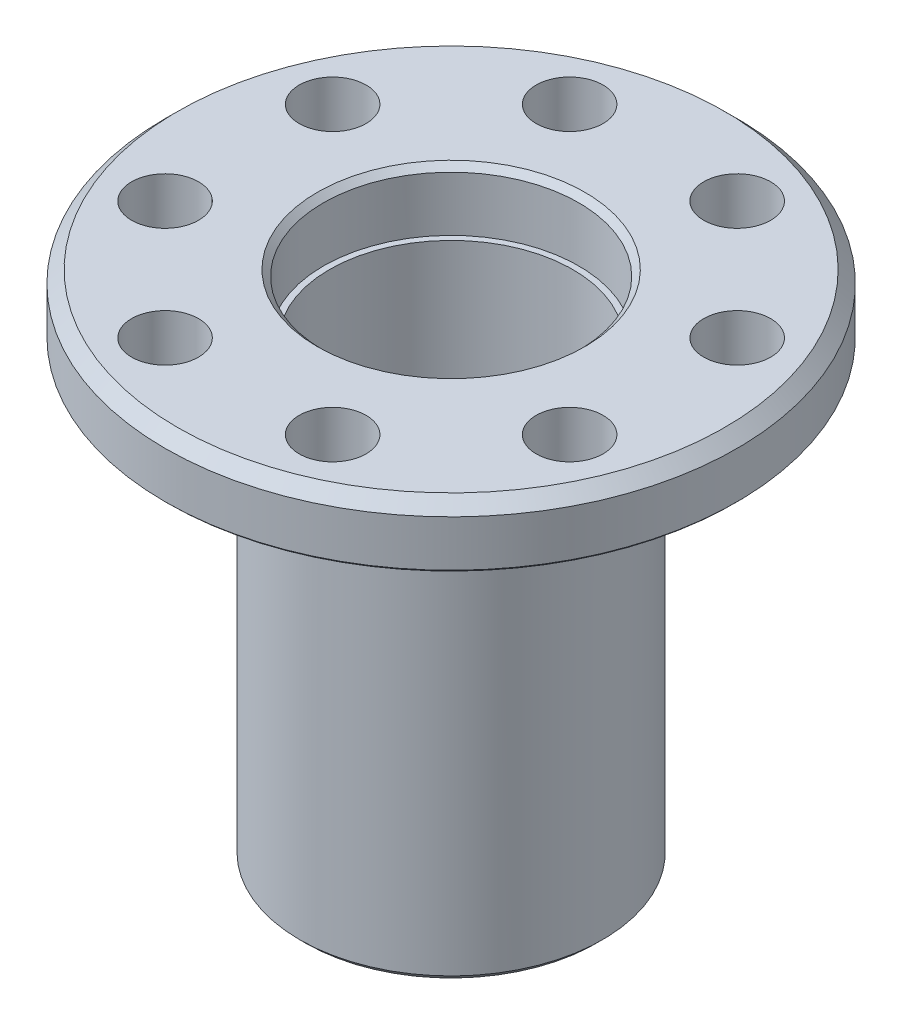
ISO-10303-21;
HEADER;
FILE_DESCRIPTION(('STEP AP214'),'2;1');
FILE_NAME('part.step','',(''),(''),'','','');
FILE_SCHEMA(('AUTOMOTIVE_DESIGN { 1 0 10303 214 1 1 1 1 }'));
ENDSEC;
DATA;
#1=APPLICATION_CONTEXT('core data for automotive mechanical design processes');
#2=APPLICATION_PROTOCOL_DEFINITION('international standard','automotive_design',2000,#1);
#3=PRODUCT_CONTEXT('',#1,'mechanical');
#4=PRODUCT('Part','Part','',(#3));
#5=PRODUCT_RELATED_PRODUCT_CATEGORY('part','',(#4));
#6=PRODUCT_DEFINITION_FORMATION('','',#4);
#7=PRODUCT_DEFINITION_CONTEXT('part definition',#1,'design');
#8=PRODUCT_DEFINITION('design','',#6,#7);
#9=PRODUCT_DEFINITION_SHAPE('','',#8);
#10=(LENGTH_UNIT() NAMED_UNIT(*) SI_UNIT(.MILLI.,.METRE.));
#11=(NAMED_UNIT(*) PLANE_ANGLE_UNIT() SI_UNIT($,.RADIAN.));
#12=(NAMED_UNIT(*) SI_UNIT($,.STERADIAN.) SOLID_ANGLE_UNIT());
#13=UNCERTAINTY_MEASURE_WITH_UNIT(LENGTH_MEASURE(1.E-05),#10,'distance_accuracy_value','');
#14=(GEOMETRIC_REPRESENTATION_CONTEXT(3) GLOBAL_UNCERTAINTY_ASSIGNED_CONTEXT((#13)) GLOBAL_UNIT_ASSIGNED_CONTEXT((#10,
#11,#12)) REPRESENTATION_CONTEXT('',''));
#15=CARTESIAN_POINT('',(0.,0.,0.));
#16=DIRECTION('',(0.,0.,1.));
#17=DIRECTION('',(1.,0.,0.));
#18=AXIS2_PLACEMENT_3D('',#15,#16,#17);
#19=CARTESIAN_POINT('',(16.6298315852,42.,6.888301782572));
#20=DIRECTION('',(0.,-1.,0.));
#21=DIRECTION('',(0.707106781186548,0.,0.707106781186548));
#22=AXIS2_PLACEMENT_3D('',#19,#20,#21);
#23=CYLINDRICAL_SURFACE('',#22,2.75);
#24=CARTESIAN_POINT('',(16.6298315852,42.,6.888301782572));
#25=DIRECTION('',(0.,-1.,0.));
#26=DIRECTION('',(0.707106781186597,0.,0.707106781186498));
#27=AXIS2_PLACEMENT_3D('',#24,#25,#26);
#28=CIRCLE('',#27,2.75);
#29=CARTESIAN_POINT('',(14.685287936937,42.,4.94375813430899));
#30=VERTEX_POINT('',#29);
#31=EDGE_CURVE('E204',#30,#30,#28,.T.);
#32=ORIENTED_EDGE('',*,*,#31,.F.);
#33=DIRECTION('',(0.,-1.,0.));
#34=VECTOR('',#33,1.);
#35=CARTESIAN_POINT('',(14.685287936937,42.,4.94375813430899));
#36=LINE('',#35,#34);
#37=CARTESIAN_POINT('',(14.685287936937,37.,4.94375813430899));
#38=VERTEX_POINT('',#37);
#39=EDGE_CURVE('E11',#30,#38,#36,.T.);
#40=ORIENTED_EDGE('',*,*,#39,.T.);
#41=CARTESIAN_POINT('',(16.6298315852,37.,6.888301782572));
#42=DIRECTION('',(0.,-1.,0.));
#43=DIRECTION('',(0.707106781186597,0.,0.707106781186498));
#44=AXIS2_PLACEMENT_3D('',#41,#42,#43);
#45=CIRCLE('',#44,2.75);
#46=EDGE_CURVE('E206',#38,#38,#45,.T.);
#47=ORIENTED_EDGE('',*,*,#46,.T.);
#48=ORIENTED_EDGE('',*,*,#39,.F.);
#49=EDGE_LOOP('',(#32,#40,#47,#48));
#50=FACE_BOUND('',#49,.T.);
#51=ADVANCED_FACE('F17',(#50),#23,.F.);
#52=CARTESIAN_POINT('',(6.888301782572,42.,16.6298315852));
#53=DIRECTION('',(0.,-1.,0.));
#54=DIRECTION('',(0.,0.,1.));
#55=AXIS2_PLACEMENT_3D('',#52,#53,#54);
#56=CYLINDRICAL_SURFACE('',#55,2.75);
#57=CARTESIAN_POINT('',(6.888301782572,42.,16.6298315852));
#58=DIRECTION('',(0.,-1.,0.));
#59=DIRECTION('',(0.,0.,1.));
#60=AXIS2_PLACEMENT_3D('',#57,#58,#59);
#61=CIRCLE('',#60,2.75);
#62=CARTESIAN_POINT('',(6.888301782572,42.,13.8798315852));
#63=VERTEX_POINT('',#62);
#64=EDGE_CURVE('E212',#63,#63,#61,.T.);
#65=ORIENTED_EDGE('',*,*,#64,.F.);
#66=DIRECTION('',(0.,-1.,0.));
#67=VECTOR('',#66,1.);
#68=CARTESIAN_POINT('',(6.888301782572,42.,13.8798315852));
#69=LINE('',#68,#67);
#70=CARTESIAN_POINT('',(6.888301782572,37.,13.8798315852));
#71=VERTEX_POINT('',#70);
#72=EDGE_CURVE('E28',#63,#71,#69,.T.);
#73=ORIENTED_EDGE('',*,*,#72,.T.);
#74=CARTESIAN_POINT('',(6.888301782572,37.,16.6298315852));
#75=DIRECTION('',(0.,-1.,0.));
#76=DIRECTION('',(0.,0.,1.));
#77=AXIS2_PLACEMENT_3D('',#74,#75,#76);
#78=CIRCLE('',#77,2.75);
#79=EDGE_CURVE('E243',#71,#71,#78,.T.);
#80=ORIENTED_EDGE('',*,*,#79,.T.);
#81=ORIENTED_EDGE('',*,*,#72,.F.);
#82=EDGE_LOOP('',(#65,#73,#80,#81));
#83=FACE_BOUND('',#82,.T.);
#84=ADVANCED_FACE('F702',(#83),#56,.F.);
#85=CARTESIAN_POINT('',(-6.888301782572,42.,16.6298315852));
#86=DIRECTION('',(0.,-1.,0.));
#87=DIRECTION('',(-0.707106781186548,0.,0.707106781186548));
#88=AXIS2_PLACEMENT_3D('',#85,#86,#87);
#89=CYLINDRICAL_SURFACE('',#88,2.75);
#90=CARTESIAN_POINT('',(-6.888301782572,42.,16.6298315852));
#91=DIRECTION('',(0.,-1.,0.));
#92=DIRECTION('',(-0.707106781186548,0.,0.707106781186548));
#93=AXIS2_PLACEMENT_3D('',#90,#91,#92);
#94=CIRCLE('',#93,2.75);
#95=CARTESIAN_POINT('',(-4.94375813430899,42.,14.685287936937));
#96=VERTEX_POINT('',#95);
#97=EDGE_CURVE('E223',#96,#96,#94,.T.);
#98=ORIENTED_EDGE('',*,*,#97,.F.);
#99=DIRECTION('',(0.,-1.,0.));
#100=VECTOR('',#99,1.);
#101=CARTESIAN_POINT('',(-4.94375813430899,42.,14.685287936937));
#102=LINE('',#101,#100);
#103=CARTESIAN_POINT('',(-4.94375813430899,37.,14.685287936937));
#104=VERTEX_POINT('',#103);
#105=EDGE_CURVE('E235',#96,#104,#102,.T.);
#106=ORIENTED_EDGE('',*,*,#105,.T.);
#107=CARTESIAN_POINT('',(-6.888301782572,37.,16.6298315852));
#108=DIRECTION('',(0.,-1.,0.));
#109=DIRECTION('',(-0.707106781186548,0.,0.707106781186548));
#110=AXIS2_PLACEMENT_3D('',#107,#108,#109);
#111=CIRCLE('',#110,2.75);
#112=EDGE_CURVE('E239',#104,#104,#111,.T.);
#113=ORIENTED_EDGE('',*,*,#112,.T.);
#114=ORIENTED_EDGE('',*,*,#105,.F.);
#115=EDGE_LOOP('',(#98,#106,#113,#114));
#116=FACE_BOUND('',#115,.T.);
#117=ADVANCED_FACE('F739',(#116),#89,.F.);
#118=CARTESIAN_POINT('',(-16.6298315852,42.,6.888301782572));
#119=DIRECTION('',(0.,-1.,0.));
#120=DIRECTION('',(-1.,0.,0.));
#121=AXIS2_PLACEMENT_3D('',#118,#119,#120);
#122=CYLINDRICAL_SURFACE('',#121,2.75);
#123=CARTESIAN_POINT('',(-16.6298315852,42.,6.888301782572));
#124=DIRECTION('',(0.,-1.,0.));
#125=DIRECTION('',(-1.,0.,0.));
#126=AXIS2_PLACEMENT_3D('',#123,#124,#125);
#127=CIRCLE('',#126,2.75);
#128=CARTESIAN_POINT('',(-13.8798315852,42.,6.888301782572));
#129=VERTEX_POINT('',#128);
#130=EDGE_CURVE('E288',#129,#129,#127,.T.);
#131=ORIENTED_EDGE('',*,*,#130,.F.);
#132=DIRECTION('',(0.,-1.,0.));
#133=VECTOR('',#132,1.);
#134=CARTESIAN_POINT('',(-13.8798315852,42.,6.888301782572));
#135=LINE('',#134,#133);
#136=CARTESIAN_POINT('',(-13.8798315852,37.,6.888301782572));
#137=VERTEX_POINT('',#136);
#138=EDGE_CURVE('E238',#129,#137,#135,.T.);
#139=ORIENTED_EDGE('',*,*,#138,.T.);
#140=CARTESIAN_POINT('',(-16.6298315852,37.,6.888301782572));
#141=DIRECTION('',(0.,-1.,0.));
#142=DIRECTION('',(-1.,0.,0.));
#143=AXIS2_PLACEMENT_3D('',#140,#141,#142);
#144=CIRCLE('',#143,2.75);
#145=EDGE_CURVE('E244',#137,#137,#144,.T.);
#146=ORIENTED_EDGE('',*,*,#145,.T.);
#147=ORIENTED_EDGE('',*,*,#138,.F.);
#148=EDGE_LOOP('',(#131,#139,#146,#147));
#149=FACE_BOUND('',#148,.T.);
#150=ADVANCED_FACE('F774',(#149),#122,.F.);
#151=CARTESIAN_POINT('',(-16.6298315852,42.,-6.888301782572));
#152=DIRECTION('',(0.,-1.,0.));
#153=DIRECTION('',(-0.707106781186548,0.,-0.707106781186548));
#154=AXIS2_PLACEMENT_3D('',#151,#152,#153);
#155=CYLINDRICAL_SURFACE('',#154,2.75);
#156=CARTESIAN_POINT('',(-16.6298315852,42.,-6.888301782572));
#157=DIRECTION('',(0.,-1.,0.));
#158=DIRECTION('',(-0.707106781186548,0.,-0.707106781186548));
#159=AXIS2_PLACEMENT_3D('',#156,#157,#158);
#160=CIRCLE('',#159,2.75);
#161=CARTESIAN_POINT('',(-14.685287936937,42.,-4.94375813430899));
#162=VERTEX_POINT('',#161);
#163=EDGE_CURVE('E291',#162,#162,#160,.T.);
#164=ORIENTED_EDGE('',*,*,#163,.F.);
#165=DIRECTION('',(0.,-1.,0.));
#166=VECTOR('',#165,1.);
#167=CARTESIAN_POINT('',(-14.685287936937,42.,-4.94375813430899));
#168=LINE('',#167,#166);
#169=CARTESIAN_POINT('',(-14.685287936937,37.,-4.94375813430899));
#170=VERTEX_POINT('',#169);
#171=EDGE_CURVE('E686',#162,#170,#168,.T.);
#172=ORIENTED_EDGE('',*,*,#171,.T.);
#173=CARTESIAN_POINT('',(-16.6298315852,37.,-6.888301782572));
#174=DIRECTION('',(0.,-1.,0.));
#175=DIRECTION('',(-0.707106781186548,0.,-0.707106781186548));
#176=AXIS2_PLACEMENT_3D('',#173,#174,#175);
#177=CIRCLE('',#176,2.75);
#178=EDGE_CURVE('E353',#170,#170,#177,.T.);
#179=ORIENTED_EDGE('',*,*,#178,.T.);
#180=ORIENTED_EDGE('',*,*,#171,.F.);
#181=EDGE_LOOP('',(#164,#172,#179,#180));
#182=FACE_BOUND('',#181,.T.);
#183=ADVANCED_FACE('F19',(#182),#155,.F.);
#184=CARTESIAN_POINT('',(-6.888301782572,42.,-16.6298315852));
#185=DIRECTION('',(0.,-1.,0.));
#186=DIRECTION('',(0.,0.,-1.));
#187=AXIS2_PLACEMENT_3D('',#184,#185,#186);
#188=CYLINDRICAL_SURFACE('',#187,2.75);
#189=CARTESIAN_POINT('',(-6.888301782572,42.,-16.6298315852));
#190=DIRECTION('',(0.,-1.,0.));
#191=DIRECTION('',(0.,0.,-1.));
#192=AXIS2_PLACEMENT_3D('',#189,#190,#191);
#193=CIRCLE('',#192,2.75);
#194=CARTESIAN_POINT('',(-6.888301782572,42.,-13.8798315852));
#195=VERTEX_POINT('',#194);
#196=EDGE_CURVE('E276',#195,#195,#193,.T.);
#197=ORIENTED_EDGE('',*,*,#196,.F.);
#198=DIRECTION('',(0.,-1.,0.));
#199=VECTOR('',#198,1.);
#200=CARTESIAN_POINT('',(-6.888301782572,42.,-13.8798315852));
#201=LINE('',#200,#199);
#202=CARTESIAN_POINT('',(-6.888301782572,37.,-13.8798315852));
#203=VERTEX_POINT('',#202);
#204=EDGE_CURVE('E625',#195,#203,#201,.T.);
#205=ORIENTED_EDGE('',*,*,#204,.T.);
#206=CARTESIAN_POINT('',(-6.888301782572,37.,-16.6298315852));
#207=DIRECTION('',(0.,-1.,0.));
#208=DIRECTION('',(0.,0.,-1.));
#209=AXIS2_PLACEMENT_3D('',#206,#207,#208);
#210=CIRCLE('',#209,2.75);
#211=EDGE_CURVE('E368',#203,#203,#210,.T.);
#212=ORIENTED_EDGE('',*,*,#211,.T.);
#213=ORIENTED_EDGE('',*,*,#204,.F.);
#214=EDGE_LOOP('',(#197,#205,#212,#213));
#215=FACE_BOUND('',#214,.T.);
#216=ADVANCED_FACE('F804',(#215),#188,.F.);
#217=CARTESIAN_POINT('',(6.888301782572,42.,-16.6298315852));
#218=DIRECTION('',(0.,-1.,0.));
#219=DIRECTION('',(0.707106781186548,0.,-0.707106781186548));
#220=AXIS2_PLACEMENT_3D('',#217,#218,#219);
#221=CYLINDRICAL_SURFACE('',#220,2.75);
#222=CARTESIAN_POINT('',(6.888301782572,42.,-16.6298315852));
#223=DIRECTION('',(0.,-1.,0.));
#224=DIRECTION('',(0.707106781186548,0.,-0.707106781186548));
#225=AXIS2_PLACEMENT_3D('',#222,#223,#224);
#226=CIRCLE('',#225,2.75);
#227=CARTESIAN_POINT('',(4.94375813430899,42.,-14.685287936937));
#228=VERTEX_POINT('',#227);
#229=EDGE_CURVE('E272',#228,#228,#226,.T.);
#230=ORIENTED_EDGE('',*,*,#229,.F.);
#231=DIRECTION('',(0.,-1.,0.));
#232=VECTOR('',#231,1.);
#233=CARTESIAN_POINT('',(4.94375813430899,42.,-14.685287936937));
#234=LINE('',#233,#232);
#235=CARTESIAN_POINT('',(4.94375813430899,37.,-14.685287936937));
#236=VERTEX_POINT('',#235);
#237=EDGE_CURVE('E255',#228,#236,#234,.T.);
#238=ORIENTED_EDGE('',*,*,#237,.T.);
#239=CARTESIAN_POINT('',(6.888301782572,37.,-16.6298315852));
#240=DIRECTION('',(0.,-1.,0.));
#241=DIRECTION('',(0.707106781186548,0.,-0.707106781186548));
#242=AXIS2_PLACEMENT_3D('',#239,#240,#241);
#243=CIRCLE('',#242,2.75);
#244=EDGE_CURVE('E335',#236,#236,#243,.T.);
#245=ORIENTED_EDGE('',*,*,#244,.T.);
#246=ORIENTED_EDGE('',*,*,#237,.F.);
#247=EDGE_LOOP('',(#230,#238,#245,#246));
#248=FACE_BOUND('',#247,.T.);
#249=ADVANCED_FACE('F742',(#248),#221,.F.);
#250=CARTESIAN_POINT('',(16.6298315852,42.,-6.888301782572));
#251=DIRECTION('',(0.,-1.,0.));
#252=DIRECTION('',(1.,0.,0.));
#253=AXIS2_PLACEMENT_3D('',#250,#251,#252);
#254=CYLINDRICAL_SURFACE('',#253,2.75);
#255=CARTESIAN_POINT('',(16.6298315852,42.,-6.888301782572));
#256=DIRECTION('',(0.,-1.,0.));
#257=DIRECTION('',(1.,0.,0.));
#258=AXIS2_PLACEMENT_3D('',#255,#256,#257);
#259=CIRCLE('',#258,2.75);
#260=CARTESIAN_POINT('',(13.8798315852,42.,-6.888301782572));
#261=VERTEX_POINT('',#260);
#262=EDGE_CURVE('E277',#261,#261,#259,.T.);
#263=ORIENTED_EDGE('',*,*,#262,.F.);
#264=DIRECTION('',(0.,-1.,0.));
#265=VECTOR('',#264,1.);
#266=CARTESIAN_POINT('',(13.8798315852,42.,-6.888301782572));
#267=LINE('',#266,#265);
#268=CARTESIAN_POINT('',(13.8798315852,37.,-6.888301782572));
#269=VERTEX_POINT('',#268);
#270=EDGE_CURVE('E251',#261,#269,#267,.T.);
#271=ORIENTED_EDGE('',*,*,#270,.T.);
#272=CARTESIAN_POINT('',(16.6298315852,37.,-6.888301782572));
#273=DIRECTION('',(0.,-1.,0.));
#274=DIRECTION('',(1.,0.,0.));
#275=AXIS2_PLACEMENT_3D('',#272,#273,#274);
#276=CIRCLE('',#275,2.75);
#277=EDGE_CURVE('E326',#269,#269,#276,.T.);
#278=ORIENTED_EDGE('',*,*,#277,.T.);
#279=ORIENTED_EDGE('',*,*,#270,.F.);
#280=EDGE_LOOP('',(#263,#271,#278,#279));
#281=FACE_BOUND('',#280,.T.);
#282=ADVANCED_FACE('F800',(#281),#254,.F.);
#283=CARTESIAN_POINT('',(-6.005216961323,4.,-2.487442310373));
#284=DIRECTION('',(0.,1.,0.));
#285=DIRECTION('',(1.,0.,0.));
#286=AXIS2_PLACEMENT_3D('',#283,#284,#285);
#287=PLANE('',#286);
#288=CARTESIAN_POINT('',(0.,4.,0.));
#289=DIRECTION('',(0.,1.,0.));
#290=DIRECTION('',(-0.90514753832633,0.,-0.425097558052014));
#291=AXIS2_PLACEMENT_3D('',#288,#289,#290);
#292=CIRCLE('',#291,8.999971884152);
#293=CARTESIAN_POINT('',(-8.146302395946,4.,-3.82586607049));
#294=VERTEX_POINT('',#293);
#295=CARTESIAN_POINT('',(-8.465601508125,4.,-3.055009823415));
#296=VERTEX_POINT('',#295);
#297=EDGE_CURVE('E296',#294,#296,#292,.T.);
#298=ORIENTED_EDGE('',*,*,#297,.T.);
#299=CARTESIAN_POINT('',(-6.005216961323,4.,-2.487442310373));
#300=DIRECTION('',(0.,1.,0.));
#301=DIRECTION('',(-0.847954627573497,0.,-0.530068815887798));
#302=AXIS2_PLACEMENT_3D('',#299,#300,#301);
#303=CIRCLE('',#302,2.525);
#304=EDGE_CURVE('E268',#294,#296,#303,.T.);
#305=ORIENTED_EDGE('',*,*,#304,.F.);
#306=EDGE_LOOP('',(#298,#305));
#307=FACE_BOUND('',#306,.T.);
#308=ADVANCED_FACE('F438',(#307),#287,.F.);
#309=CARTESIAN_POINT('',(-6.005216961323,0.2500000069079,-2.487442310373));
#310=DIRECTION('',(0.,-1.,0.));
#311=DIRECTION('',(0.,0.,-1.));
#312=AXIS2_PLACEMENT_3D('',#309,#310,#311);
#313=CONICAL_SURFACE('',#312,2.774999993092,0.785398163397448);
#314=CARTESIAN_POINT('',(-6.005216961323,0.5,-2.487442310373));
#315=DIRECTION('',(0.,1.,0.));
#316=DIRECTION('',(1.,0.,0.));
#317=AXIS2_PLACEMENT_3D('',#314,#315,#316);
#318=CIRCLE('',#317,2.525);
#319=CARTESIAN_POINT('',(-3.480216961323,0.5,-2.487442310373));
#320=VERTEX_POINT('',#319);
#321=CARTESIAN_POINT('',(-6.005216961323,0.49999999999995,0.0375576896269495));
#322=VERTEX_POINT('',#321);
#323=EDGE_CURVE('E256',#320,#322,#318,.T.);
#324=ORIENTED_EDGE('',*,*,#323,.T.);
#325=DIRECTION('',(0.,-0.707106781186548,0.707106781186548));
#326=VECTOR('',#325,1.);
#327=CARTESIAN_POINT('',(-6.005216961323,0.2500000069079,0.287557682719));
#328=LINE('',#327,#326);
#329=CARTESIAN_POINT('',(-6.005216961323,0.,0.53755768962695));
#330=VERTEX_POINT('',#329);
#331=EDGE_CURVE('E42',#322,#330,#328,.T.);
#332=ORIENTED_EDGE('',*,*,#331,.T.);
#333=CARTESIAN_POINT('',(-6.005216961323,0.,-2.487442310373));
#334=DIRECTION('',(0.,1.,0.));
#335=DIRECTION('',(-1.,0.,0.));
#336=AXIS2_PLACEMENT_3D('',#333,#334,#335);
#337=CIRCLE('',#336,3.025);
#338=EDGE_CURVE('E308',#330,#330,#337,.T.);
#339=ORIENTED_EDGE('',*,*,#338,.F.);
#340=ORIENTED_EDGE('',*,*,#331,.F.);
#341=CARTESIAN_POINT('',(-6.005216961323,0.5,-2.487442310373));
#342=DIRECTION('',(0.,1.,0.));
#343=DIRECTION('',(1.,0.,0.));
#344=AXIS2_PLACEMENT_3D('',#341,#342,#343);
#345=CIRCLE('',#344,2.525);
#346=EDGE_CURVE('E271',#322,#320,#345,.T.);
#347=ORIENTED_EDGE('',*,*,#346,.T.);
#348=EDGE_LOOP('',(#324,#332,#339,#340,#347));
#349=FACE_BOUND('',#348,.T.);
#350=ADVANCED_FACE('F784',(#349),#313,.F.);
#351=CARTESIAN_POINT('',(-6.005216961323,0.,-2.487442310373));
#352=DIRECTION('',(0.,1.,0.));
#353=DIRECTION('',(-1.,0.,0.));
#354=AXIS2_PLACEMENT_3D('',#351,#352,#353);
#355=CYLINDRICAL_SURFACE('',#354,2.525);
#356=ORIENTED_EDGE('',*,*,#323,.F.);
#357=DIRECTION('',(0.,1.,0.));
#358=VECTOR('',#357,1.);
#359=CARTESIAN_POINT('',(-3.480216961323,0.,-2.487442310373));
#360=LINE('',#359,#358);
#361=CARTESIAN_POINT('',(-3.480216961323,4.,-2.487442310373));
#362=VERTEX_POINT('',#361);
#363=EDGE_CURVE('E260',#320,#362,#360,.T.);
#364=ORIENTED_EDGE('',*,*,#363,.T.);
#365=CARTESIAN_POINT('',(-6.005216961323,4.,-2.487442310373));
#366=DIRECTION('',(0.,1.,0.));
#367=DIRECTION('',(-0.974409721505506,0.,-0.224779213086001));
#368=AXIS2_PLACEMENT_3D('',#365,#366,#367);
#369=CIRCLE('',#368,2.525);
#370=EDGE_CURVE('E358',#362,#294,#369,.T.);
#371=ORIENTED_EDGE('',*,*,#370,.T.);
#372=ORIENTED_EDGE('',*,*,#304,.T.);
#373=CARTESIAN_POINT('',(-6.005216961323,4.,-2.487442310373));
#374=DIRECTION('',(0.,1.,0.));
#375=DIRECTION('',(-0.974409721505506,0.,-0.224779213086001));
#376=AXIS2_PLACEMENT_3D('',#373,#374,#375);
#377=CIRCLE('',#376,2.525);
#378=EDGE_CURVE('E234',#296,#362,#377,.T.);
#379=ORIENTED_EDGE('',*,*,#378,.T.);
#380=ORIENTED_EDGE('',*,*,#363,.F.);
#381=ORIENTED_EDGE('',*,*,#346,.F.);
#382=EDGE_LOOP('',(#356,#364,#371,#372,#379,#380,#381));
#383=FACE_BOUND('',#382,.T.);
#384=ADVANCED_FACE('F443',(#383),#355,.F.);
#385=CARTESIAN_POINT('',(6.005216961323,4.,2.487442310373));
#386=DIRECTION('',(0.,1.,0.));
#387=DIRECTION('',(1.,0.,0.));
#388=AXIS2_PLACEMENT_3D('',#385,#386,#387);
#389=PLANE('',#388);
#390=CARTESIAN_POINT('',(0.,4.,0.));
#391=DIRECTION('',(0.,1.,0.));
#392=DIRECTION('',(0.90514753832633,0.,0.425097558052014));
#393=AXIS2_PLACEMENT_3D('',#390,#391,#392);
#394=CIRCLE('',#393,8.999971884152);
#395=CARTESIAN_POINT('',(8.146302395946,4.,3.82586607049));
#396=VERTEX_POINT('',#395);
#397=CARTESIAN_POINT('',(8.465601508125,4.,3.055009823415));
#398=VERTEX_POINT('',#397);
#399=EDGE_CURVE('E262',#396,#398,#394,.T.);
#400=ORIENTED_EDGE('',*,*,#399,.T.);
#401=CARTESIAN_POINT('',(6.005216961323,4.,2.487442310373));
#402=DIRECTION('',(0.,1.,0.));
#403=DIRECTION('',(0.847954627573497,0.,0.530068815887798));
#404=AXIS2_PLACEMENT_3D('',#401,#402,#403);
#405=CIRCLE('',#404,2.525);
#406=EDGE_CURVE('E390',#396,#398,#405,.T.);
#407=ORIENTED_EDGE('',*,*,#406,.F.);
#408=EDGE_LOOP('',(#400,#407));
#409=FACE_BOUND('',#408,.T.);
#410=ADVANCED_FACE('F431',(#409),#389,.F.);
#411=CARTESIAN_POINT('',(6.005216961323,0.2500000069079,2.487442310373));
#412=DIRECTION('',(0.,-1.,0.));
#413=DIRECTION('',(0.,0.,-1.));
#414=AXIS2_PLACEMENT_3D('',#411,#412,#413);
#415=CONICAL_SURFACE('',#414,2.774999993092,0.785398163397448);
#416=CARTESIAN_POINT('',(6.005216961323,0.5,2.487442310373));
#417=DIRECTION('',(0.,1.,0.));
#418=DIRECTION('',(-1.,0.,0.));
#419=AXIS2_PLACEMENT_3D('',#416,#417,#418);
#420=CIRCLE('',#419,2.525);
#421=CARTESIAN_POINT('',(8.530216961323,0.5,2.487442310373));
#422=VERTEX_POINT('',#421);
#423=CARTESIAN_POINT('',(6.005216961323,0.49999999999995,5.01244231037295));
#424=VERTEX_POINT('',#423);
#425=EDGE_CURVE('E233',#422,#424,#420,.T.);
#426=ORIENTED_EDGE('',*,*,#425,.T.);
#427=DIRECTION('',(0.,-0.707106781186548,0.707106781186548));
#428=VECTOR('',#427,1.);
#429=CARTESIAN_POINT('',(6.005216961323,0.2500000069079,5.262442303465));
#430=LINE('',#429,#428);
#431=CARTESIAN_POINT('',(6.005216961323,0.,5.51244231037295));
#432=VERTEX_POINT('',#431);
#433=EDGE_CURVE('E261',#424,#432,#430,.T.);
#434=ORIENTED_EDGE('',*,*,#433,.T.);
#435=CARTESIAN_POINT('',(6.005216961323,0.,2.487442310373));
#436=DIRECTION('',(0.,1.,0.));
#437=DIRECTION('',(-1.,0.,0.));
#438=AXIS2_PLACEMENT_3D('',#435,#436,#437);
#439=CIRCLE('',#438,3.025);
#440=EDGE_CURVE('E304',#432,#432,#439,.T.);
#441=ORIENTED_EDGE('',*,*,#440,.F.);
#442=ORIENTED_EDGE('',*,*,#433,.F.);
#443=CARTESIAN_POINT('',(6.005216961323,0.5,2.487442310373));
#444=DIRECTION('',(0.,1.,0.));
#445=DIRECTION('',(-1.,0.,0.));
#446=AXIS2_PLACEMENT_3D('',#443,#444,#445);
#447=CIRCLE('',#446,2.525);
#448=EDGE_CURVE('E386',#424,#422,#447,.T.);
#449=ORIENTED_EDGE('',*,*,#448,.T.);
#450=EDGE_LOOP('',(#426,#434,#441,#442,#449));
#451=FACE_BOUND('',#450,.T.);
#452=ADVANCED_FACE('F787',(#451),#415,.F.);
#453=CARTESIAN_POINT('',(6.005216961323,0.,2.487442310373));
#454=DIRECTION('',(0.,1.,0.));
#455=DIRECTION('',(-1.,0.,0.));
#456=AXIS2_PLACEMENT_3D('',#453,#454,#455);
#457=CYLINDRICAL_SURFACE('',#456,2.525);
#458=ORIENTED_EDGE('',*,*,#425,.F.);
#459=DIRECTION('',(0.,1.,0.));
#460=VECTOR('',#459,1.);
#461=CARTESIAN_POINT('',(8.530216961323,0.,2.487442310373));
#462=LINE('',#461,#460);
#463=CARTESIAN_POINT('',(8.530216961323,4.,2.487442310373));
#464=VERTEX_POINT('',#463);
#465=EDGE_CURVE('E398',#422,#464,#462,.T.);
#466=ORIENTED_EDGE('',*,*,#465,.T.);
#467=CARTESIAN_POINT('',(6.005216961323,4.,2.487442310373));
#468=DIRECTION('',(0.,1.,0.));
#469=DIRECTION('',(0.974409721505506,0.,0.224779213086001));
#470=AXIS2_PLACEMENT_3D('',#467,#468,#469);
#471=CIRCLE('',#470,2.525);
#472=EDGE_CURVE('E229',#464,#396,#471,.T.);
#473=ORIENTED_EDGE('',*,*,#472,.T.);
#474=ORIENTED_EDGE('',*,*,#406,.T.);
#475=CARTESIAN_POINT('',(6.005216961323,4.,2.487442310373));
#476=DIRECTION('',(0.,1.,0.));
#477=DIRECTION('',(0.974409721505506,0.,0.224779213086001));
#478=AXIS2_PLACEMENT_3D('',#475,#476,#477);
#479=CIRCLE('',#478,2.525);
#480=EDGE_CURVE('E266',#398,#464,#479,.T.);
#481=ORIENTED_EDGE('',*,*,#480,.T.);
#482=ORIENTED_EDGE('',*,*,#465,.F.);
#483=ORIENTED_EDGE('',*,*,#448,.F.);
#484=EDGE_LOOP('',(#458,#466,#473,#474,#481,#482,#483));
#485=FACE_BOUND('',#484,.T.);
#486=ADVANCED_FACE('F418',(#485),#457,.F.);
#487=CARTESIAN_POINT('',(0.,4.,0.));
#488=DIRECTION('',(0.,1.,0.));
#489=DIRECTION('',(1.,0.,0.));
#490=AXIS2_PLACEMENT_3D('',#487,#488,#489);
#491=PLANE('',#490);
#492=ORIENTED_EDGE('',*,*,#480,.F.);
#493=CARTESIAN_POINT('',(0.,4.,0.));
#494=DIRECTION('',(0.,-1.,0.));
#495=DIRECTION('',(1.,0.,0.));
#496=AXIS2_PLACEMENT_3D('',#493,#494,#495);
#497=CIRCLE('',#496,8.999971884152);
#498=EDGE_CURVE('E267',#294,#398,#497,.T.);
#499=ORIENTED_EDGE('',*,*,#498,.F.);
#500=ORIENTED_EDGE('',*,*,#370,.F.);
#501=ORIENTED_EDGE('',*,*,#378,.F.);
#502=CARTESIAN_POINT('',(0.,4.,0.));
#503=DIRECTION('',(0.,-1.,0.));
#504=DIRECTION('',(-1.,0.,0.));
#505=AXIS2_PLACEMENT_3D('',#502,#503,#504);
#506=CIRCLE('',#505,8.999971884152);
#507=CARTESIAN_POINT('',(0.,4.00000000000006,8.99997188415192));
#508=VERTEX_POINT('',#507);
#509=EDGE_CURVE('E378',#508,#296,#506,.T.);
#510=ORIENTED_EDGE('',*,*,#509,.F.);
#511=CARTESIAN_POINT('',(0.,4.,0.));
#512=DIRECTION('',(0.,-1.,0.));
#513=DIRECTION('',(-1.,0.,0.));
#514=AXIS2_PLACEMENT_3D('',#511,#512,#513);
#515=CIRCLE('',#514,8.999971884152);
#516=EDGE_CURVE('E379',#396,#508,#515,.T.);
#517=ORIENTED_EDGE('',*,*,#516,.F.);
#518=ORIENTED_EDGE('',*,*,#472,.F.);
#519=EDGE_LOOP('',(#492,#499,#500,#501,#510,#517,#518));
#520=FACE_BOUND('',#519,.T.);
#521=ADVANCED_FACE('F425',(#520),#491,.T.);
#522=CARTESIAN_POINT('',(0.,4.500020926245,0.));
#523=DIRECTION('',(0.,1.,0.));
#524=DIRECTION('',(0.,0.,-1.));
#525=AXIS2_PLACEMENT_3D('',#522,#523,#524);
#526=CONICAL_SURFACE('',#525,9.49999124834,0.785396601403516);
#527=ORIENTED_EDGE('',*,*,#516,.T.);
#528=DIRECTION('',(0.,0.707107885682187,0.707105676689183));
#529=VECTOR('',#528,1.);
#530=CARTESIAN_POINT('',(0.,4.500020926245,9.49999124834));
#531=LINE('',#530,#529);
#532=CARTESIAN_POINT('',(0.,5.00003123992872,10.));
#533=VERTEX_POINT('',#532);
#534=EDGE_CURVE('E375',#508,#533,#531,.T.);
#535=ORIENTED_EDGE('',*,*,#534,.T.);
#536=CARTESIAN_POINT('',(0.,5.00003123992871,0.));
#537=DIRECTION('',(0.,-1.,0.));
#538=DIRECTION('',(1.,0.,0.));
#539=AXIS2_PLACEMENT_3D('',#536,#537,#538);
#540=CIRCLE('',#539,10.);
#541=CARTESIAN_POINT('',(-10.,5.00003123992871,0.));
#542=VERTEX_POINT('',#541);
#543=EDGE_CURVE('E282',#542,#533,#540,.T.);
#544=ORIENTED_EDGE('',*,*,#543,.F.);
#545=CARTESIAN_POINT('',(0.,5.00003123992871,0.));
#546=DIRECTION('',(0.,-1.,0.));
#547=DIRECTION('',(1.,0.,0.));
#548=AXIS2_PLACEMENT_3D('',#545,#546,#547);
#549=CIRCLE('',#548,10.);
#550=EDGE_CURVE('E278',#533,#542,#549,.T.);
#551=ORIENTED_EDGE('',*,*,#550,.F.);
#552=ORIENTED_EDGE('',*,*,#534,.F.);
#553=ORIENTED_EDGE('',*,*,#509,.T.);
#554=ORIENTED_EDGE('',*,*,#297,.F.);
#555=ORIENTED_EDGE('',*,*,#498,.T.);
#556=ORIENTED_EDGE('',*,*,#399,.F.);
#557=EDGE_LOOP('',(#527,#535,#544,#551,#552,#553,#554,#555,#556));
#558=FACE_BOUND('',#557,.T.);
#559=ADVANCED_FACE('F434',(#558),#526,.F.);
#560=CARTESIAN_POINT('',(0.,-2.1,0.));
#561=DIRECTION('',(0.,1.,0.));
#562=DIRECTION('',(1.,0.,0.));
#563=AXIS2_PLACEMENT_3D('',#560,#561,#562);
#564=CYLINDRICAL_SURFACE('',#563,10.);
#565=ORIENTED_EDGE('',*,*,#543,.T.);
#566=ORIENTED_EDGE('',*,*,#550,.T.);
#567=DIRECTION('',(0.,1.,0.));
#568=VECTOR('',#567,1.);
#569=CARTESIAN_POINT('',(-10.,-2.1,0.));
#570=LINE('',#569,#568);
#571=CARTESIAN_POINT('',(-10.,37.,0.));
#572=VERTEX_POINT('',#571);
#573=EDGE_CURVE('E21',#542,#572,#570,.T.);
#574=ORIENTED_EDGE('',*,*,#573,.T.);
#575=CARTESIAN_POINT('',(0.,37.,0.));
#576=DIRECTION('',(0.,1.,0.));
#577=DIRECTION('',(1.,0.,0.));
#578=AXIS2_PLACEMENT_3D('',#575,#576,#577);
#579=CIRCLE('',#578,10.);
#580=EDGE_CURVE('E374',#572,#572,#579,.T.);
#581=ORIENTED_EDGE('',*,*,#580,.T.);
#582=ORIENTED_EDGE('',*,*,#573,.F.);
#583=EDGE_LOOP('',(#565,#566,#574,#581,#582));
#584=FACE_BOUND('',#583,.T.);
#585=ADVANCED_FACE('F779',(#584),#564,.F.);
#586=CARTESIAN_POINT('',(0.,37.,0.));
#587=DIRECTION('',(0.,1.,0.));
#588=DIRECTION('',(1.,0.,0.));
#589=AXIS2_PLACEMENT_3D('',#586,#587,#588);
#590=PLANE('',#589);
#591=ORIENTED_EDGE('',*,*,#580,.F.);
#592=EDGE_LOOP('',(#591));
#593=FACE_BOUND('',#592,.T.);
#594=CARTESIAN_POINT('',(0.,37.,0.));
#595=DIRECTION('',(0.,-1.,0.));
#596=DIRECTION('',(1.,0.,0.));
#597=AXIS2_PLACEMENT_3D('',#594,#595,#596);
#598=CIRCLE('',#597,10.5);
#599=CARTESIAN_POINT('',(-10.5,37.,0.));
#600=VERTEX_POINT('',#599);
#601=EDGE_CURVE('E315',#600,#600,#598,.T.);
#602=ORIENTED_EDGE('',*,*,#601,.F.);
#603=EDGE_LOOP('',(#602));
#604=FACE_BOUND('',#603,.T.);
#605=ADVANCED_FACE('F776',(#593,#604),#590,.T.);
#606=CARTESIAN_POINT('',(0.,-2.1,0.));
#607=DIRECTION('',(0.,1.,0.));
#608=DIRECTION('',(1.,0.,0.));
#609=AXIS2_PLACEMENT_3D('',#606,#607,#608);
#610=CYLINDRICAL_SURFACE('',#609,10.5);
#611=ORIENTED_EDGE('',*,*,#601,.T.);
#612=DIRECTION('',(0.,1.,0.));
#613=VECTOR('',#612,1.);
#614=CARTESIAN_POINT('',(-10.5,-2.1,0.));
#615=LINE('',#614,#613);
#616=CARTESIAN_POINT('',(-10.5,41.500009792197,0.));
#617=VERTEX_POINT('',#616);
#618=EDGE_CURVE('E319',#600,#617,#615,.T.);
#619=ORIENTED_EDGE('',*,*,#618,.T.);
#620=CARTESIAN_POINT('',(0.,41.500009792197,0.));
#621=DIRECTION('',(0.,1.,0.));
#622=DIRECTION('',(1.,0.,0.));
#623=AXIS2_PLACEMENT_3D('',#620,#621,#622);
#624=CIRCLE('',#623,10.5);
#625=CARTESIAN_POINT('',(0.,41.5000097921969,10.5));
#626=VERTEX_POINT('',#625);
#627=EDGE_CURVE('E320',#617,#626,#624,.T.);
#628=ORIENTED_EDGE('',*,*,#627,.T.);
#629=CARTESIAN_POINT('',(0.,41.500009792197,0.));
#630=DIRECTION('',(0.,1.,0.));
#631=DIRECTION('',(1.,0.,0.));
#632=AXIS2_PLACEMENT_3D('',#629,#630,#631);
#633=CIRCLE('',#632,10.5);
#634=EDGE_CURVE('E211',#626,#617,#633,.T.);
#635=ORIENTED_EDGE('',*,*,#634,.T.);
#636=ORIENTED_EDGE('',*,*,#618,.F.);
#637=EDGE_LOOP('',(#611,#619,#628,#635,#636));
#638=FACE_BOUND('',#637,.T.);
#639=ADVANCED_FACE('F770',(#638),#610,.F.);
#640=CARTESIAN_POINT('',(0.,41.75000514855,0.));
#641=DIRECTION('',(0.,1.,0.));
#642=DIRECTION('',(0.,0.,-1.));
#643=AXIS2_PLACEMENT_3D('',#640,#641,#642);
#644=CONICAL_SURFACE('',#643,10.74999512321,0.785397697102544);
#645=ORIENTED_EDGE('',*,*,#634,.F.);
#646=DIRECTION('',(0.,0.707107110906759,0.707106451466182));
#647=VECTOR('',#646,1.);
#648=CARTESIAN_POINT('',(0.,41.75000514855,10.74999512321));
#649=LINE('',#648,#647);
#650=CARTESIAN_POINT('',(0.,42.,10.9999897415174));
#651=VERTEX_POINT('',#650);
#652=EDGE_CURVE('E220',#626,#651,#649,.T.);
#653=ORIENTED_EDGE('',*,*,#652,.T.);
#654=CARTESIAN_POINT('',(0.,42.,0.));
#655=DIRECTION('',(0.,1.,0.));
#656=DIRECTION('',(0.,0.,-1.));
#657=AXIS2_PLACEMENT_3D('',#654,#655,#656);
#658=CIRCLE('',#657,10.9999897415175);
#659=EDGE_CURVE('E300',#651,#651,#658,.T.);
#660=ORIENTED_EDGE('',*,*,#659,.T.);
#661=ORIENTED_EDGE('',*,*,#652,.F.);
#662=ORIENTED_EDGE('',*,*,#627,.F.);
#663=EDGE_LOOP('',(#645,#653,#660,#661,#662));
#664=FACE_BOUND('',#663,.T.);
#665=ADVANCED_FACE('F758',(#664),#644,.F.);
#666=CARTESIAN_POINT('',(0.,42.,0.));
#667=DIRECTION('',(0.,1.,0.));
#668=DIRECTION('',(1.,0.,0.));
#669=AXIS2_PLACEMENT_3D('',#666,#667,#668);
#670=PLANE('',#669);
#671=ORIENTED_EDGE('',*,*,#31,.T.);
#672=EDGE_LOOP('',(#671));
#673=FACE_BOUND('',#672,.T.);
#674=ORIENTED_EDGE('',*,*,#64,.T.);
#675=EDGE_LOOP('',(#674));
#676=FACE_BOUND('',#675,.T.);
#677=ORIENTED_EDGE('',*,*,#97,.T.);
#678=EDGE_LOOP('',(#677));
#679=FACE_BOUND('',#678,.T.);
#680=ORIENTED_EDGE('',*,*,#130,.T.);
#681=EDGE_LOOP('',(#680));
#682=FACE_BOUND('',#681,.T.);
#683=ORIENTED_EDGE('',*,*,#163,.T.);
#684=EDGE_LOOP('',(#683));
#685=FACE_BOUND('',#684,.T.);
#686=ORIENTED_EDGE('',*,*,#196,.T.);
#687=EDGE_LOOP('',(#686));
#688=FACE_BOUND('',#687,.T.);
#689=ORIENTED_EDGE('',*,*,#229,.T.);
#690=EDGE_LOOP('',(#689));
#691=FACE_BOUND('',#690,.T.);
#692=ORIENTED_EDGE('',*,*,#262,.T.);
#693=EDGE_LOOP('',(#692));
#694=FACE_BOUND('',#693,.T.);
#695=ORIENTED_EDGE('',*,*,#659,.F.);
#696=EDGE_LOOP('',(#695));
#697=FACE_BOUND('',#696,.T.);
#698=CARTESIAN_POINT('',(0.,42.00000241433,0.));
#699=DIRECTION('',(0.,1.,0.));
#700=DIRECTION('',(1.,0.,0.));
#701=AXIS2_PLACEMENT_3D('',#698,#699,#700);
#702=CIRCLE('',#701,22.49999987973);
#703=CARTESIAN_POINT('',(0.,42.0000024143303,22.4999998797304));
#704=VERTEX_POINT('',#703);
#705=EDGE_CURVE('E527',#704,#704,#702,.T.);
#706=ORIENTED_EDGE('',*,*,#705,.T.);
#707=EDGE_LOOP('',(#706));
#708=FACE_BOUND('',#707,.T.);
#709=ADVANCED_FACE('F208',(#673,#676,#679,#682,#685,#688,#691,#694,#697,#708),#670,.T.);
#710=CARTESIAN_POINT('',(0.,41.50000068628,0.));
#711=DIRECTION('',(0.,-1.,0.));
#712=DIRECTION('',(0.,0.,-1.));
#713=AXIS2_PLACEMENT_3D('',#710,#711,#712);
#714=CONICAL_SURFACE('',#713,23.00000165876,0.785398214376596);
#715=CARTESIAN_POINT('',(0.,41.000002396019,0.));
#716=DIRECTION('',(0.,1.,0.));
#717=DIRECTION('',(1.,0.,0.));
#718=AXIS2_PLACEMENT_3D('',#715,#716,#717);
#719=CIRCLE('',#718,23.5);
#720=CARTESIAN_POINT('',(-23.5,41.000002396019,0.));
#721=VERTEX_POINT('',#720);
#722=CARTESIAN_POINT('',(0.,41.000002396019,23.5));
#723=VERTEX_POINT('',#722);
#724=EDGE_CURVE('E286',#721,#723,#719,.T.);
#725=ORIENTED_EDGE('',*,*,#724,.T.);
#726=DIRECTION('',(0.,0.707106745138846,-0.707106817234248));
#727=VECTOR('',#726,1.);
#728=CARTESIAN_POINT('',(0.,41.50000068628,23.00000165876));
#729=LINE('',#728,#727);
#730=EDGE_CURVE('E227',#723,#704,#729,.T.);
#731=ORIENTED_EDGE('',*,*,#730,.T.);
#732=ORIENTED_EDGE('',*,*,#705,.F.);
#733=ORIENTED_EDGE('',*,*,#730,.F.);
#734=CARTESIAN_POINT('',(0.,41.000002396019,0.));
#735=DIRECTION('',(0.,1.,0.));
#736=DIRECTION('',(1.,0.,0.));
#737=AXIS2_PLACEMENT_3D('',#734,#735,#736);
#738=CIRCLE('',#737,23.5);
#739=EDGE_CURVE('E354',#723,#721,#738,.T.);
#740=ORIENTED_EDGE('',*,*,#739,.T.);
#741=EDGE_LOOP('',(#725,#731,#732,#733,#740));
#742=FACE_BOUND('',#741,.T.);
#743=ADVANCED_FACE('F749',(#742),#714,.T.);
#744=CARTESIAN_POINT('',(0.,-2.1,0.));
#745=DIRECTION('',(0.,1.,0.));
#746=DIRECTION('',(1.,0.,0.));
#747=AXIS2_PLACEMENT_3D('',#744,#745,#746);
#748=CYLINDRICAL_SURFACE('',#747,23.5);
#749=ORIENTED_EDGE('',*,*,#724,.F.);
#750=DIRECTION('',(0.,-1.,0.));
#751=VECTOR('',#750,1.);
#752=CARTESIAN_POINT('',(-23.5,-2.1,0.));
#753=LINE('',#752,#751);
#754=CARTESIAN_POINT('',(-23.5,37.20000203191,0.));
#755=VERTEX_POINT('',#754);
#756=EDGE_CURVE('E357',#721,#755,#753,.T.);
#757=ORIENTED_EDGE('',*,*,#756,.T.);
#758=CARTESIAN_POINT('',(0.,37.20000203191,0.));
#759=DIRECTION('',(0.,1.,0.));
#760=DIRECTION('',(1.,0.,0.));
#761=AXIS2_PLACEMENT_3D('',#758,#759,#760);
#762=CIRCLE('',#761,23.5);
#763=CARTESIAN_POINT('',(0.,37.2000022778398,23.4999997540702));
#764=VERTEX_POINT('',#763);
#765=EDGE_CURVE('E364',#755,#764,#762,.T.);
#766=ORIENTED_EDGE('',*,*,#765,.T.);
#767=CARTESIAN_POINT('',(0.,37.20000203191,0.));
#768=DIRECTION('',(0.,1.,0.));
#769=DIRECTION('',(1.,0.,0.));
#770=AXIS2_PLACEMENT_3D('',#767,#768,#769);
#771=CIRCLE('',#770,23.5);
#772=EDGE_CURVE('E287',#764,#755,#771,.T.);
#773=ORIENTED_EDGE('',*,*,#772,.T.);
#774=ORIENTED_EDGE('',*,*,#756,.F.);
#775=ORIENTED_EDGE('',*,*,#739,.F.);
#776=EDGE_LOOP('',(#749,#757,#766,#773,#774,#775));
#777=FACE_BOUND('',#776,.T.);
#778=ADVANCED_FACE('F746',(#777),#748,.T.);
#779=CARTESIAN_POINT('',(0.,37.10000137248,-1.27453603227E-13));
#780=DIRECTION('',(0.,1.,0.));
#781=DIRECTION('',(0.,0.,-1.));
#782=AXIS2_PLACEMENT_3D('',#779,#780,#781);
#783=CONICAL_SURFACE('',#782,23.39999885945,0.7853981097003);
#784=ORIENTED_EDGE('',*,*,#765,.F.);
#785=ORIENTED_EDGE('',*,*,#772,.F.);
#786=DIRECTION('',(0.,-0.707106819156165,-0.707106743216928));
#787=VECTOR('',#786,1.);
#788=CARTESIAN_POINT('',(0.,37.10000137248,23.3999988594499));
#789=LINE('',#788,#787);
#790=CARTESIAN_POINT('',(0.,37.0000002529352,23.2999977506446));
#791=VERTEX_POINT('',#790);
#792=EDGE_CURVE('E283',#764,#791,#789,.T.);
#793=ORIENTED_EDGE('',*,*,#792,.T.);
#794=CARTESIAN_POINT('',(0.,37.00000025293,-1.27453603227E-13));
#795=DIRECTION('',(0.,1.,0.));
#796=DIRECTION('',(1.,0.,0.));
#797=AXIS2_PLACEMENT_3D('',#794,#795,#796);
#798=CIRCLE('',#797,23.29999775065);
#799=EDGE_CURVE('E323',#791,#791,#798,.T.);
#800=ORIENTED_EDGE('',*,*,#799,.T.);
#801=ORIENTED_EDGE('',*,*,#792,.F.);
#802=EDGE_LOOP('',(#784,#785,#793,#800,#801));
#803=FACE_BOUND('',#802,.T.);
#804=ADVANCED_FACE('F708',(#803),#783,.T.);
#805=CARTESIAN_POINT('',(0.,37.,0.));
#806=DIRECTION('',(0.,1.,0.));
#807=DIRECTION('',(1.,0.,0.));
#808=AXIS2_PLACEMENT_3D('',#805,#806,#807);
#809=PLANE('',#808);
#810=ORIENTED_EDGE('',*,*,#46,.F.);
#811=EDGE_LOOP('',(#810));
#812=FACE_BOUND('',#811,.T.);
#813=ORIENTED_EDGE('',*,*,#79,.F.);
#814=EDGE_LOOP('',(#813));
#815=FACE_BOUND('',#814,.T.);
#816=ORIENTED_EDGE('',*,*,#112,.F.);
#817=EDGE_LOOP('',(#816));
#818=FACE_BOUND('',#817,.T.);
#819=ORIENTED_EDGE('',*,*,#145,.F.);
#820=EDGE_LOOP('',(#819));
#821=FACE_BOUND('',#820,.T.);
#822=ORIENTED_EDGE('',*,*,#178,.F.);
#823=EDGE_LOOP('',(#822));
#824=FACE_BOUND('',#823,.T.);
#825=ORIENTED_EDGE('',*,*,#211,.F.);
#826=EDGE_LOOP('',(#825));
#827=FACE_BOUND('',#826,.T.);
#828=ORIENTED_EDGE('',*,*,#244,.F.);
#829=EDGE_LOOP('',(#828));
#830=FACE_BOUND('',#829,.T.);
#831=ORIENTED_EDGE('',*,*,#277,.F.);
#832=EDGE_LOOP('',(#831));
#833=FACE_BOUND('',#832,.T.);
#834=CARTESIAN_POINT('',(0.,37.,0.));
#835=DIRECTION('',(0.,1.,0.));
#836=DIRECTION('',(1.,0.,0.));
#837=AXIS2_PLACEMENT_3D('',#834,#835,#836);
#838=CIRCLE('',#837,12.45);
#839=CARTESIAN_POINT('',(-12.45,37.,0.));
#840=VERTEX_POINT('',#839);
#841=EDGE_CURVE('E337',#840,#840,#838,.T.);
#842=ORIENTED_EDGE('',*,*,#841,.T.);
#843=EDGE_LOOP('',(#842));
#844=FACE_BOUND('',#843,.T.);
#845=ORIENTED_EDGE('',*,*,#799,.F.);
#846=EDGE_LOOP('',(#845));
#847=FACE_BOUND('',#846,.T.);
#848=ADVANCED_FACE('F704',(#812,#815,#818,#821,#824,#827,#830,#833,#844,#847),#809,.F.);
#849=CARTESIAN_POINT('',(0.,-2.1,0.));
#850=DIRECTION('',(0.,1.,0.));
#851=DIRECTION('',(1.,0.,0.));
#852=AXIS2_PLACEMENT_3D('',#849,#850,#851);
#853=CYLINDRICAL_SURFACE('',#852,12.45);
#854=ORIENTED_EDGE('',*,*,#841,.F.);
#855=DIRECTION('',(0.,-1.,0.));
#856=VECTOR('',#855,1.);
#857=CARTESIAN_POINT('',(-12.45,-2.1,0.));
#858=LINE('',#857,#856);
#859=CARTESIAN_POINT('',(-12.45,0.500011269634449,0.));
#860=VERTEX_POINT('',#859);
#861=EDGE_CURVE('E327',#840,#860,#858,.T.);
#862=ORIENTED_EDGE('',*,*,#861,.T.);
#863=CARTESIAN_POINT('',(0.,0.500011269634449,0.));
#864=DIRECTION('',(0.,1.,0.));
#865=DIRECTION('',(1.,0.,0.));
#866=AXIS2_PLACEMENT_3D('',#863,#864,#865);
#867=CIRCLE('',#866,12.45);
#868=CARTESIAN_POINT('',(0.,0.500011269634465,12.45));
#869=VERTEX_POINT('',#868);
#870=EDGE_CURVE('E249',#860,#869,#867,.T.);
#871=ORIENTED_EDGE('',*,*,#870,.T.);
#872=CARTESIAN_POINT('',(0.,0.500011269634449,0.));
#873=DIRECTION('',(0.,1.,0.));
#874=DIRECTION('',(1.,0.,0.));
#875=AXIS2_PLACEMENT_3D('',#872,#873,#874);
#876=CIRCLE('',#875,12.45);
#877=EDGE_CURVE('E245',#869,#860,#876,.T.);
#878=ORIENTED_EDGE('',*,*,#877,.T.);
#879=ORIENTED_EDGE('',*,*,#861,.F.);
#880=EDGE_LOOP('',(#854,#862,#871,#878,#879));
#881=FACE_BOUND('',#880,.T.);
#882=ADVANCED_FACE('F707',(#881),#853,.T.);
#883=CARTESIAN_POINT('',(0.,0.2500060699422,0.));
#884=DIRECTION('',(0.,1.,0.));
#885=DIRECTION('',(0.,0.,-1.));
#886=AXIS2_PLACEMENT_3D('',#883,#884,#885);
#887=CONICAL_SURFACE('',#886,12.19999502661,0.785397710802157);
#888=ORIENTED_EDGE('',*,*,#870,.F.);
#889=ORIENTED_EDGE('',*,*,#877,.F.);
#890=DIRECTION('',(0.,-0.707107101219675,-0.707106461153276));
#891=VECTOR('',#890,1.);
#892=CARTESIAN_POINT('',(0.,0.2500060699422,12.19999502661));
#893=LINE('',#892,#891);
#894=CARTESIAN_POINT('',(0.,0.,11.9499891829708));
#895=VERTEX_POINT('',#894);
#896=EDGE_CURVE('E248',#869,#895,#893,.T.);
#897=ORIENTED_EDGE('',*,*,#896,.T.);
#898=CARTESIAN_POINT('',(0.,0.,0.));
#899=DIRECTION('',(0.,1.,0.));
#900=DIRECTION('',(0.,0.,-1.));
#901=AXIS2_PLACEMENT_3D('',#898,#899,#900);
#902=CIRCLE('',#901,11.9499891829708);
#903=EDGE_CURVE('E309',#895,#895,#902,.T.);
#904=ORIENTED_EDGE('',*,*,#903,.T.);
#905=ORIENTED_EDGE('',*,*,#896,.F.);
#906=EDGE_LOOP('',(#888,#889,#897,#904,#905));
#907=FACE_BOUND('',#906,.T.);
#908=ADVANCED_FACE('F468',(#907),#887,.T.);
#909=CARTESIAN_POINT('',(0.,0.,0.));
#910=DIRECTION('',(0.,1.,0.));
#911=DIRECTION('',(1.,0.,0.));
#912=AXIS2_PLACEMENT_3D('',#909,#910,#911);
#913=PLANE('',#912);
#914=ORIENTED_EDGE('',*,*,#338,.T.);
#915=EDGE_LOOP('',(#914));
#916=FACE_BOUND('',#915,.T.);
#917=ORIENTED_EDGE('',*,*,#440,.T.);
#918=EDGE_LOOP('',(#917));
#919=FACE_BOUND('',#918,.T.);
#920=ORIENTED_EDGE('',*,*,#903,.F.);
#921=EDGE_LOOP('',(#920));
#922=FACE_BOUND('',#921,.T.);
#923=ADVANCED_FACE('F730',(#916,#919,#922),#913,.F.);
#924=CLOSED_SHELL('',(#51,#84,#117,#150,#183,#216,#249,#282,#308,#350,#384,#410,#452,#486,#521,
#559,#585,#605,#639,#665,#709,#743,#778,#804,#848,#882,#908,#923));
#925=MANIFOLD_SOLID_BREP('B1',#924);
#926=ADVANCED_BREP_SHAPE_REPRESENTATION('',(#18,#925),#14);
#927=SHAPE_DEFINITION_REPRESENTATION(#9,#926);
ENDSEC;
END-ISO-10303-21;
